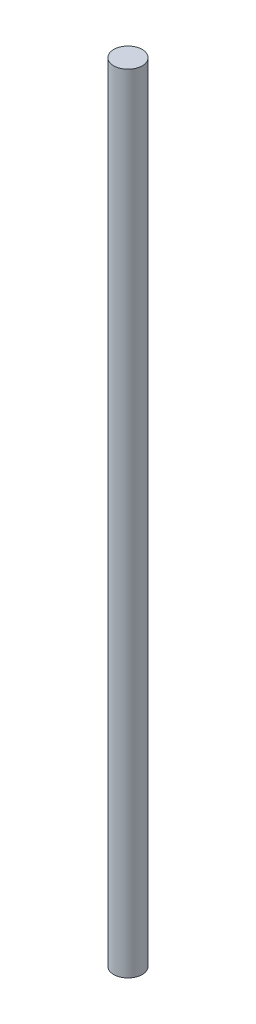
ISO-10303-21;
HEADER;
FILE_DESCRIPTION(('STEP AP214'),'2;1');
FILE_NAME('part.step','',(''),(''),'','','');
FILE_SCHEMA(('AUTOMOTIVE_DESIGN { 1 0 10303 214 1 1 1 1 }'));
ENDSEC;
DATA;
#1=APPLICATION_CONTEXT('core data for automotive mechanical design processes');
#2=APPLICATION_PROTOCOL_DEFINITION('international standard','automotive_design',2000,#1);
#3=PRODUCT_CONTEXT('',#1,'mechanical');
#4=PRODUCT('Part','Part','',(#3));
#5=PRODUCT_RELATED_PRODUCT_CATEGORY('part','',(#4));
#6=PRODUCT_DEFINITION_FORMATION('','',#4);
#7=PRODUCT_DEFINITION_CONTEXT('part definition',#1,'design');
#8=PRODUCT_DEFINITION('design','',#6,#7);
#9=PRODUCT_DEFINITION_SHAPE('','',#8);
#10=(LENGTH_UNIT() NAMED_UNIT(*) SI_UNIT(.MILLI.,.METRE.));
#11=(NAMED_UNIT(*) PLANE_ANGLE_UNIT() SI_UNIT($,.RADIAN.));
#12=(NAMED_UNIT(*) SI_UNIT($,.STERADIAN.) SOLID_ANGLE_UNIT());
#13=UNCERTAINTY_MEASURE_WITH_UNIT(LENGTH_MEASURE(1.E-05),#10,'distance_accuracy_value','');
#14=(GEOMETRIC_REPRESENTATION_CONTEXT(3) GLOBAL_UNCERTAINTY_ASSIGNED_CONTEXT((#13)) GLOBAL_UNIT_ASSIGNED_CONTEXT((#10,
#11,#12)) REPRESENTATION_CONTEXT('',''));
#15=CARTESIAN_POINT('',(0.,0.,0.));
#16=DIRECTION('',(0.,0.,1.));
#17=DIRECTION('',(1.,0.,0.));
#18=AXIS2_PLACEMENT_3D('',#15,#16,#17);
#19=CARTESIAN_POINT('',(0.,41.5,0.));
#20=DIRECTION('',(0.,-1.,0.));
#21=DIRECTION('',(0.,0.,-1.));
#22=AXIS2_PLACEMENT_3D('',#19,#20,#21);
#23=CYLINDRICAL_SURFACE('',#22,1.5);
#24=CARTESIAN_POINT('',(0.,41.5,0.));
#25=DIRECTION('',(0.,1.,0.));
#26=DIRECTION('',(0.,0.,1.));
#27=AXIS2_PLACEMENT_3D('',#24,#25,#26);
#28=CIRCLE('',#27,1.5);
#29=CARTESIAN_POINT('',(0.,41.5,1.5));
#30=VERTEX_POINT('',#29);
#31=EDGE_CURVE('E10',#30,#30,#28,.T.);
#32=ORIENTED_EDGE('',*,*,#31,.F.);
#33=EDGE_LOOP('',(#32));
#34=FACE_BOUND('',#33,.T.);
#35=CARTESIAN_POINT('',(0.,-41.5,0.));
#36=DIRECTION('',(0.,1.,0.));
#37=DIRECTION('',(0.,0.,1.));
#38=AXIS2_PLACEMENT_3D('',#35,#36,#37);
#39=CIRCLE('',#38,1.5);
#40=CARTESIAN_POINT('',(0.,-41.5,1.5));
#41=VERTEX_POINT('',#40);
#42=EDGE_CURVE('E38',#41,#41,#39,.T.);
#43=ORIENTED_EDGE('',*,*,#42,.T.);
#44=EDGE_LOOP('',(#43));
#45=FACE_BOUND('',#44,.T.);
#46=ADVANCED_FACE('F35',(#34,#45),#23,.T.);
#47=CARTESIAN_POINT('',(0.,41.5,0.));
#48=DIRECTION('',(0.,1.,0.));
#49=DIRECTION('',(0.,0.,1.));
#50=AXIS2_PLACEMENT_3D('',#47,#48,#49);
#51=PLANE('',#50);
#52=ORIENTED_EDGE('',*,*,#31,.T.);
#53=EDGE_LOOP('',(#52));
#54=FACE_BOUND('',#53,.T.);
#55=ADVANCED_FACE('F50',(#54),#51,.T.);
#56=CARTESIAN_POINT('',(0.,-41.5,0.));
#57=DIRECTION('',(0.,1.,0.));
#58=DIRECTION('',(0.,0.,1.));
#59=AXIS2_PLACEMENT_3D('',#56,#57,#58);
#60=PLANE('',#59);
#61=ORIENTED_EDGE('',*,*,#42,.F.);
#62=EDGE_LOOP('',(#61));
#63=FACE_BOUND('',#62,.T.);
#64=ADVANCED_FACE('F48',(#63),#60,.F.);
#65=CLOSED_SHELL('',(#46,#55,#64));
#66=MANIFOLD_SOLID_BREP('B2',#65);
#67=ADVANCED_BREP_SHAPE_REPRESENTATION('',(#18,#66),#14);
#68=SHAPE_DEFINITION_REPRESENTATION(#9,#67);
ENDSEC;
END-ISO-10303-21;
